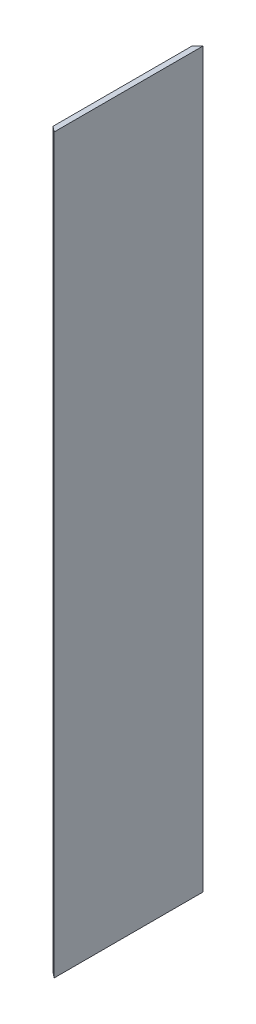
ISO-10303-21;
HEADER;
FILE_DESCRIPTION(('STEP AP214'),'2;1');
FILE_NAME('part.step','',(''),(''),'','','');
FILE_SCHEMA(('AUTOMOTIVE_DESIGN { 1 0 10303 214 1 1 1 1 }'));
ENDSEC;
DATA;
#1=APPLICATION_CONTEXT('core data for automotive mechanical design processes');
#2=APPLICATION_PROTOCOL_DEFINITION('international standard','automotive_design',2000,#1);
#3=PRODUCT_CONTEXT('',#1,'mechanical');
#4=PRODUCT('Part','Part','',(#3));
#5=PRODUCT_RELATED_PRODUCT_CATEGORY('part','',(#4));
#6=PRODUCT_DEFINITION_FORMATION('','',#4);
#7=PRODUCT_DEFINITION_CONTEXT('part definition',#1,'design');
#8=PRODUCT_DEFINITION('design','',#6,#7);
#9=PRODUCT_DEFINITION_SHAPE('','',#8);
#10=(LENGTH_UNIT() NAMED_UNIT(*) SI_UNIT(.MILLI.,.METRE.));
#11=(NAMED_UNIT(*) PLANE_ANGLE_UNIT() SI_UNIT($,.RADIAN.));
#12=(NAMED_UNIT(*) SI_UNIT($,.STERADIAN.) SOLID_ANGLE_UNIT());
#13=UNCERTAINTY_MEASURE_WITH_UNIT(LENGTH_MEASURE(1.E-05),#10,'distance_accuracy_value','');
#14=(GEOMETRIC_REPRESENTATION_CONTEXT(3) GLOBAL_UNCERTAINTY_ASSIGNED_CONTEXT((#13)) GLOBAL_UNIT_ASSIGNED_CONTEXT((#10,
#11,#12)) REPRESENTATION_CONTEXT('',''));
#15=CARTESIAN_POINT('',(0.,0.,0.));
#16=DIRECTION('',(0.,0.,1.));
#17=DIRECTION('',(1.,0.,0.));
#18=AXIS2_PLACEMENT_3D('',#15,#16,#17);
#19=CARTESIAN_POINT('',(5.02637904605247,533.,-0.491200201083911));
#20=DIRECTION('',(0.704704028835697,0.,0.709501396575607));
#21=DIRECTION('',(0.709501396575607,0.,-0.704704028835697));
#22=AXIS2_PLACEMENT_3D('',#19,#20,#21);
#23=PLANE('',#22);
#24=DIRECTION('',(-0.709501396575607,0.,0.704704028835697));
#25=VECTOR('',#24,1.);
#26=CARTESIAN_POINT('',(5.02637904605247,0.,-0.491200201083911));
#27=LINE('',#26,#25);
#28=CARTESIAN_POINT('',(5.02637904605247,0.,-0.491200201083911));
#29=VERTEX_POINT('',#28);
#30=CARTESIAN_POINT('',(1.02637904605246,0.,3.48175338145693));
#31=VERTEX_POINT('',#30);
#32=EDGE_CURVE('E96',#29,#31,#27,.T.);
#33=ORIENTED_EDGE('',*,*,#32,.T.);
#34=DIRECTION('',(0.,-1.,0.));
#35=VECTOR('',#34,1.);
#36=CARTESIAN_POINT('',(1.02637904605246,533.,3.48175338145693));
#37=LINE('',#36,#35);
#38=CARTESIAN_POINT('',(1.02637904605246,533.,3.48175338145693));
#39=VERTEX_POINT('',#38);
#40=EDGE_CURVE('E11',#39,#31,#37,.T.);
#41=ORIENTED_EDGE('',*,*,#40,.F.);
#42=DIRECTION('',(-0.709501396575607,0.,0.704704028835697));
#43=VECTOR('',#42,1.);
#44=CARTESIAN_POINT('',(5.02637904605247,533.,-0.491200201083911));
#45=LINE('',#44,#43);
#46=CARTESIAN_POINT('',(5.02637904605247,533.,-0.491200201083911));
#47=VERTEX_POINT('',#46);
#48=EDGE_CURVE('E84',#47,#39,#45,.T.);
#49=ORIENTED_EDGE('',*,*,#48,.F.);
#50=DIRECTION('',(0.,-1.,0.));
#51=VECTOR('',#50,1.);
#52=CARTESIAN_POINT('',(5.02637904605247,533.,-0.491200201083911));
#53=LINE('',#52,#51);
#54=EDGE_CURVE('E92',#47,#29,#53,.T.);
#55=ORIENTED_EDGE('',*,*,#54,.T.);
#56=EDGE_LOOP('',(#33,#41,#49,#55));
#57=FACE_BOUND('',#56,.T.);
#58=ADVANCED_FACE('F33',(#57),#23,.F.);
#59=CARTESIAN_POINT('',(1.02637904605246,533.,3.48175338145693));
#60=DIRECTION('',(1.,0.,0.));
#61=DIRECTION('',(0.,0.,-1.));
#62=AXIS2_PLACEMENT_3D('',#59,#60,#61);
#63=PLANE('',#62);
#64=DIRECTION('',(0.,0.,1.));
#65=VECTOR('',#64,1.);
#66=CARTESIAN_POINT('',(1.02637904605246,0.,3.48175338145693));
#67=LINE('',#66,#65);
#68=CARTESIAN_POINT('',(1.02637904605246,0.,104.641612003353));
#69=VERTEX_POINT('',#68);
#70=EDGE_CURVE('E88',#31,#69,#67,.T.);
#71=ORIENTED_EDGE('',*,*,#70,.T.);
#72=DIRECTION('',(0.,-1.,0.));
#73=VECTOR('',#72,1.);
#74=CARTESIAN_POINT('',(1.02637904605246,533.,104.641612003353));
#75=LINE('',#74,#73);
#76=CARTESIAN_POINT('',(1.02637904605246,533.,104.641612003353));
#77=VERTEX_POINT('',#76);
#78=EDGE_CURVE('E41',#77,#69,#75,.T.);
#79=ORIENTED_EDGE('',*,*,#78,.F.);
#80=DIRECTION('',(0.,0.,1.));
#81=VECTOR('',#80,1.);
#82=CARTESIAN_POINT('',(1.02637904605246,533.,3.48175338145693));
#83=LINE('',#82,#81);
#84=EDGE_CURVE('E79',#39,#77,#83,.T.);
#85=ORIENTED_EDGE('',*,*,#84,.F.);
#86=ORIENTED_EDGE('',*,*,#40,.T.);
#87=EDGE_LOOP('',(#71,#79,#85,#86));
#88=FACE_BOUND('',#87,.T.);
#89=ADVANCED_FACE('F87',(#88),#63,.F.);
#90=CARTESIAN_POINT('',(1.02637904605246,533.,104.641612003353));
#91=DIRECTION('',(0.624360124885333,0.,-0.78113662982424));
#92=DIRECTION('',(-0.78113662982424,0.,-0.624360124885333));
#93=AXIS2_PLACEMENT_3D('',#90,#91,#92);
#94=PLANE('',#93);
#95=DIRECTION('',(0.78113662982424,0.,0.624360124885333));
#96=VECTOR('',#95,1.);
#97=CARTESIAN_POINT('',(1.02637904605246,0.,104.641612003353));
#98=LINE('',#97,#96);
#99=CARTESIAN_POINT('',(5.02637904605247,0.,107.838799798916));
#100=VERTEX_POINT('',#99);
#101=EDGE_CURVE('E66',#69,#100,#98,.T.);
#102=ORIENTED_EDGE('',*,*,#101,.T.);
#103=DIRECTION('',(0.,-1.,0.));
#104=VECTOR('',#103,1.);
#105=CARTESIAN_POINT('',(5.02637904605247,533.,107.838799798916));
#106=LINE('',#105,#104);
#107=CARTESIAN_POINT('',(5.02637904605247,533.,107.838799798916));
#108=VERTEX_POINT('',#107);
#109=EDGE_CURVE('E89',#108,#100,#106,.T.);
#110=ORIENTED_EDGE('',*,*,#109,.F.);
#111=DIRECTION('',(0.78113662982424,0.,0.624360124885333));
#112=VECTOR('',#111,1.);
#113=CARTESIAN_POINT('',(1.02637904605246,533.,104.641612003353));
#114=LINE('',#113,#112);
#115=EDGE_CURVE('E82',#77,#108,#114,.T.);
#116=ORIENTED_EDGE('',*,*,#115,.F.);
#117=ORIENTED_EDGE('',*,*,#78,.T.);
#118=EDGE_LOOP('',(#102,#110,#116,#117));
#119=FACE_BOUND('',#118,.T.);
#120=ADVANCED_FACE('F90',(#119),#94,.F.);
#121=CARTESIAN_POINT('',(5.02637904605247,533.,107.838799798916));
#122=DIRECTION('',(-1.,0.,0.));
#123=DIRECTION('',(0.,0.,1.));
#124=AXIS2_PLACEMENT_3D('',#121,#122,#123);
#125=PLANE('',#124);
#126=DIRECTION('',(0.,0.,-1.));
#127=VECTOR('',#126,1.);
#128=CARTESIAN_POINT('',(5.02637904605247,0.,107.838799798916));
#129=LINE('',#128,#127);
#130=EDGE_CURVE('E72',#100,#29,#129,.T.);
#131=ORIENTED_EDGE('',*,*,#130,.T.);
#132=ORIENTED_EDGE('',*,*,#54,.F.);
#133=DIRECTION('',(0.,0.,-1.));
#134=VECTOR('',#133,1.);
#135=CARTESIAN_POINT('',(5.02637904605247,533.,107.838799798916));
#136=LINE('',#135,#134);
#137=EDGE_CURVE('E49',#108,#47,#136,.T.);
#138=ORIENTED_EDGE('',*,*,#137,.F.);
#139=ORIENTED_EDGE('',*,*,#109,.T.);
#140=EDGE_LOOP('',(#131,#132,#138,#139));
#141=FACE_BOUND('',#140,.T.);
#142=ADVANCED_FACE('F103',(#141),#125,.F.);
#143=CARTESIAN_POINT('',(-55.4075757603711,533.,59.5341241127391));
#144=DIRECTION('',(0.,1.,0.));
#145=DIRECTION('',(0.,0.,1.));
#146=AXIS2_PLACEMENT_3D('',#143,#144,#145);
#147=PLANE('',#146);
#148=ORIENTED_EDGE('',*,*,#48,.T.);
#149=ORIENTED_EDGE('',*,*,#84,.T.);
#150=ORIENTED_EDGE('',*,*,#115,.T.);
#151=ORIENTED_EDGE('',*,*,#137,.T.);
#152=EDGE_LOOP('',(#148,#149,#150,#151));
#153=FACE_BOUND('',#152,.T.);
#154=ADVANCED_FACE('F80',(#153),#147,.T.);
#155=CARTESIAN_POINT('',(-55.4075757603711,0.,59.5341241127391));
#156=DIRECTION('',(0.,1.,0.));
#157=DIRECTION('',(0.,0.,1.));
#158=AXIS2_PLACEMENT_3D('',#155,#156,#157);
#159=PLANE('',#158);
#160=ORIENTED_EDGE('',*,*,#32,.F.);
#161=ORIENTED_EDGE('',*,*,#130,.F.);
#162=ORIENTED_EDGE('',*,*,#101,.F.);
#163=ORIENTED_EDGE('',*,*,#70,.F.);
#164=EDGE_LOOP('',(#160,#161,#162,#163));
#165=FACE_BOUND('',#164,.T.);
#166=ADVANCED_FACE('F106',(#165),#159,.F.);
#167=CLOSED_SHELL('',(#58,#89,#120,#142,#154,#166));
#168=MANIFOLD_SOLID_BREP('B2',#167);
#169=ADVANCED_BREP_SHAPE_REPRESENTATION('',(#18,#168),#14);
#170=SHAPE_DEFINITION_REPRESENTATION(#9,#169);
ENDSEC;
END-ISO-10303-21;
